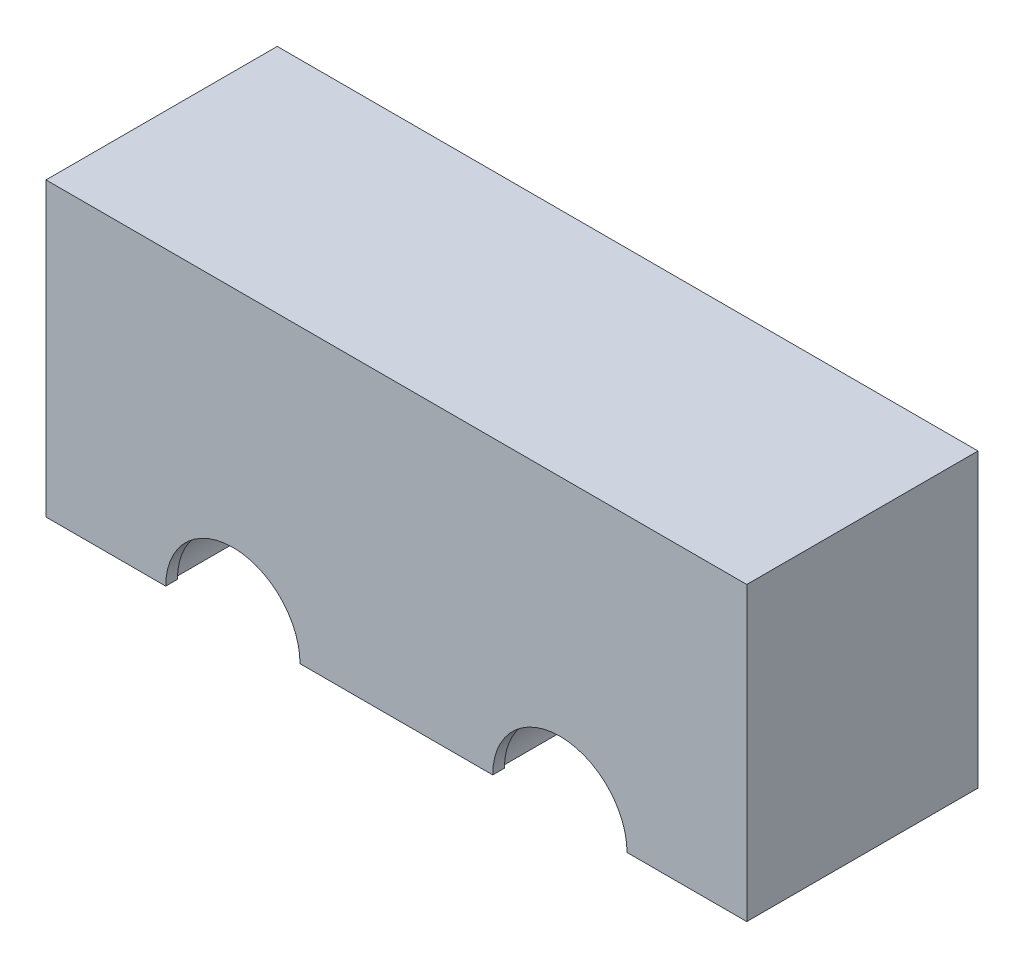
ISO-10303-21;
HEADER;
FILE_DESCRIPTION(('STEP AP214'),'2;1');
FILE_NAME('part.step','',(''),(''),'','','');
FILE_SCHEMA(('AUTOMOTIVE_DESIGN { 1 0 10303 214 1 1 1 1 }'));
ENDSEC;
DATA;
#1=APPLICATION_CONTEXT('core data for automotive mechanical design processes');
#2=APPLICATION_PROTOCOL_DEFINITION('international standard','automotive_design',2000,#1);
#3=PRODUCT_CONTEXT('',#1,'mechanical');
#4=PRODUCT('Part','Part','',(#3));
#5=PRODUCT_RELATED_PRODUCT_CATEGORY('part','',(#4));
#6=PRODUCT_DEFINITION_FORMATION('','',#4);
#7=PRODUCT_DEFINITION_CONTEXT('part definition',#1,'design');
#8=PRODUCT_DEFINITION('design','',#6,#7);
#9=PRODUCT_DEFINITION_SHAPE('','',#8);
#10=(LENGTH_UNIT() NAMED_UNIT(*) SI_UNIT(.MILLI.,.METRE.));
#11=(NAMED_UNIT(*) PLANE_ANGLE_UNIT() SI_UNIT($,.RADIAN.));
#12=(NAMED_UNIT(*) SI_UNIT($,.STERADIAN.) SOLID_ANGLE_UNIT());
#13=UNCERTAINTY_MEASURE_WITH_UNIT(LENGTH_MEASURE(1.E-05),#10,'distance_accuracy_value','');
#14=(GEOMETRIC_REPRESENTATION_CONTEXT(3) GLOBAL_UNCERTAINTY_ASSIGNED_CONTEXT((#13)) GLOBAL_UNIT_ASSIGNED_CONTEXT((#10,
#11,#12)) REPRESENTATION_CONTEXT('',''));
#15=CARTESIAN_POINT('',(0.,0.,0.));
#16=DIRECTION('',(0.,0.,1.));
#17=DIRECTION('',(1.,0.,0.));
#18=AXIS2_PLACEMENT_3D('',#15,#16,#17);
#19=CARTESIAN_POINT('',(-14.,0.,33.2164078649987));
#20=DIRECTION('',(0.,0.,-1.));
#21=DIRECTION('',(-1.,0.,0.));
#22=AXIS2_PLACEMENT_3D('',#19,#20,#21);
#23=CYLINDRICAL_SURFACE('',#22,6.);
#24=CARTESIAN_POINT('',(-14.,0.,18.8));
#25=DIRECTION('',(0.,0.,-1.));
#26=DIRECTION('',(1.,0.,0.));
#27=AXIS2_PLACEMENT_3D('',#24,#25,#26);
#28=CIRCLE('',#27,6.);
#29=CARTESIAN_POINT('',(-20.,0.,18.8));
#30=VERTEX_POINT('',#29);
#31=CARTESIAN_POINT('',(-8.,0.,18.8));
#32=VERTEX_POINT('',#31);
#33=EDGE_CURVE('E48',#30,#32,#28,.T.);
#34=ORIENTED_EDGE('',*,*,#33,.F.);
#35=DIRECTION('',(0.,0.,-1.));
#36=VECTOR('',#35,1.);
#37=CARTESIAN_POINT('',(-20.,0.,33.2164078649987));
#38=LINE('',#37,#36);
#39=CARTESIAN_POINT('',(-20.,0.,1.));
#40=VERTEX_POINT('',#39);
#41=EDGE_CURVE('E245',#30,#40,#38,.T.);
#42=ORIENTED_EDGE('',*,*,#41,.T.);
#43=CARTESIAN_POINT('',(-14.,0.,1.));
#44=DIRECTION('',(0.,0.,-1.));
#45=DIRECTION('',(1.,0.,0.));
#46=AXIS2_PLACEMENT_3D('',#43,#44,#45);
#47=CIRCLE('',#46,6.);
#48=CARTESIAN_POINT('',(-8.,0.,1.));
#49=VERTEX_POINT('',#48);
#50=EDGE_CURVE('E198',#40,#49,#47,.T.);
#51=ORIENTED_EDGE('',*,*,#50,.T.);
#52=DIRECTION('',(0.,0.,-1.));
#53=VECTOR('',#52,1.);
#54=CARTESIAN_POINT('',(-8.,0.,33.2164078649987));
#55=LINE('',#54,#53);
#56=EDGE_CURVE('E237',#32,#49,#55,.T.);
#57=ORIENTED_EDGE('',*,*,#56,.F.);
#58=EDGE_LOOP('',(#34,#42,#51,#57));
#59=FACE_BOUND('',#58,.T.);
#60=ADVANCED_FACE('F33',(#59),#23,.F.);
#61=CARTESIAN_POINT('',(14.,0.,33.2164078649987));
#62=DIRECTION('',(0.,0.,-1.));
#63=DIRECTION('',(-1.,0.,0.));
#64=AXIS2_PLACEMENT_3D('',#61,#62,#63);
#65=CYLINDRICAL_SURFACE('',#64,6.);
#66=CARTESIAN_POINT('',(14.,0.,18.8));
#67=DIRECTION('',(0.,0.,-1.));
#68=DIRECTION('',(1.,0.,0.));
#69=AXIS2_PLACEMENT_3D('',#66,#67,#68);
#70=CIRCLE('',#69,6.);
#71=CARTESIAN_POINT('',(8.,0.,18.8));
#72=VERTEX_POINT('',#71);
#73=CARTESIAN_POINT('',(20.,0.,18.8));
#74=VERTEX_POINT('',#73);
#75=EDGE_CURVE('E56',#72,#74,#70,.T.);
#76=ORIENTED_EDGE('',*,*,#75,.F.);
#77=DIRECTION('',(0.,0.,-1.));
#78=VECTOR('',#77,1.);
#79=CARTESIAN_POINT('',(8.,0.,33.2164078649987));
#80=LINE('',#79,#78);
#81=CARTESIAN_POINT('',(8.,0.,1.));
#82=VERTEX_POINT('',#81);
#83=EDGE_CURVE('E240',#72,#82,#80,.T.);
#84=ORIENTED_EDGE('',*,*,#83,.T.);
#85=CARTESIAN_POINT('',(14.,0.,1.));
#86=DIRECTION('',(0.,0.,-1.));
#87=DIRECTION('',(1.,0.,0.));
#88=AXIS2_PLACEMENT_3D('',#85,#86,#87);
#89=CIRCLE('',#88,6.);
#90=CARTESIAN_POINT('',(20.,0.,1.));
#91=VERTEX_POINT('',#90);
#92=EDGE_CURVE('E219',#82,#91,#89,.T.);
#93=ORIENTED_EDGE('',*,*,#92,.T.);
#94=DIRECTION('',(0.,0.,-1.));
#95=VECTOR('',#94,1.);
#96=CARTESIAN_POINT('',(20.,0.,33.2164078649987));
#97=LINE('',#96,#95);
#98=EDGE_CURVE('E243',#74,#91,#97,.T.);
#99=ORIENTED_EDGE('',*,*,#98,.F.);
#100=EDGE_LOOP('',(#76,#84,#93,#99));
#101=FACE_BOUND('',#100,.T.);
#102=ADVANCED_FACE('F298',(#101),#65,.F.);
#103=CARTESIAN_POINT('',(-30.,0.,19.8));
#104=DIRECTION('',(0.,1.,0.));
#105=DIRECTION('',(-1.,0.,0.));
#106=AXIS2_PLACEMENT_3D('',#103,#104,#105);
#107=PLANE('',#106);
#108=DIRECTION('',(1.,0.,0.));
#109=VECTOR('',#108,1.);
#110=CARTESIAN_POINT('',(-30.,0.,19.8));
#111=LINE('',#110,#109);
#112=CARTESIAN_POINT('',(19.75,0.,19.8));
#113=VERTEX_POINT('',#112);
#114=CARTESIAN_POINT('',(30.,0.,19.8));
#115=VERTEX_POINT('',#114);
#116=EDGE_CURVE('E158',#113,#115,#111,.T.);
#117=ORIENTED_EDGE('',*,*,#116,.F.);
#118=DIRECTION('',(0.,0.,-1.));
#119=VECTOR('',#118,1.);
#120=CARTESIAN_POINT('',(19.75,0.,19.8));
#121=LINE('',#120,#119);
#122=CARTESIAN_POINT('',(19.75,0.,18.8));
#123=VERTEX_POINT('',#122);
#124=EDGE_CURVE('E184',#113,#123,#121,.T.);
#125=ORIENTED_EDGE('',*,*,#124,.T.);
#126=DIRECTION('',(-1.,0.,0.));
#127=VECTOR('',#126,1.);
#128=CARTESIAN_POINT('',(19.75,0.,18.8));
#129=LINE('',#128,#127);
#130=EDGE_CURVE('E187',#74,#123,#129,.T.);
#131=ORIENTED_EDGE('',*,*,#130,.F.);
#132=ORIENTED_EDGE('',*,*,#98,.T.);
#133=DIRECTION('',(-1.,0.,0.));
#134=VECTOR('',#133,1.);
#135=CARTESIAN_POINT('',(19.75,0.,1.));
#136=LINE('',#135,#134);
#137=CARTESIAN_POINT('',(19.75,0.,1.));
#138=VERTEX_POINT('',#137);
#139=EDGE_CURVE('E222',#91,#138,#136,.T.);
#140=ORIENTED_EDGE('',*,*,#139,.T.);
#141=DIRECTION('',(0.,0.,-1.));
#142=VECTOR('',#141,1.);
#143=CARTESIAN_POINT('',(19.75,0.,1.));
#144=LINE('',#143,#142);
#145=CARTESIAN_POINT('',(19.75,0.,0.));
#146=VERTEX_POINT('',#145);
#147=EDGE_CURVE('E231',#138,#146,#144,.T.);
#148=ORIENTED_EDGE('',*,*,#147,.T.);
#149=DIRECTION('',(1.,0.,0.));
#150=VECTOR('',#149,1.);
#151=CARTESIAN_POINT('',(-30.,0.,0.));
#152=LINE('',#151,#150);
#153=CARTESIAN_POINT('',(30.,0.,0.));
#154=VERTEX_POINT('',#153);
#155=EDGE_CURVE('E258',#146,#154,#152,.T.);
#156=ORIENTED_EDGE('',*,*,#155,.T.);
#157=DIRECTION('',(0.,0.,-1.));
#158=VECTOR('',#157,1.);
#159=CARTESIAN_POINT('',(30.,0.,19.8));
#160=LINE('',#159,#158);
#161=EDGE_CURVE('E41',#115,#154,#160,.T.);
#162=ORIENTED_EDGE('',*,*,#161,.F.);
#163=EDGE_LOOP('',(#117,#125,#131,#132,#140,#148,#156,#162));
#164=FACE_BOUND('',#163,.T.);
#165=ADVANCED_FACE('F289',(#164),#107,.F.);
#166=CARTESIAN_POINT('',(-8.25,0.,0.));
#167=VERTEX_POINT('',#166);
#168=CARTESIAN_POINT('',(8.24999999999999,0.,0.));
#169=VERTEX_POINT('',#168);
#170=EDGE_CURVE('E262',#167,#169,#152,.T.);
#171=ORIENTED_EDGE('',*,*,#170,.T.);
#172=DIRECTION('',(0.,0.,-1.));
#173=VECTOR('',#172,1.);
#174=CARTESIAN_POINT('',(8.24999999999999,0.,1.));
#175=LINE('',#174,#173);
#176=CARTESIAN_POINT('',(8.24999999999999,0.,1.));
#177=VERTEX_POINT('',#176);
#178=EDGE_CURVE('E234',#177,#169,#175,.T.);
#179=ORIENTED_EDGE('',*,*,#178,.F.);
#180=DIRECTION('',(-1.,0.,0.));
#181=VECTOR('',#180,1.);
#182=CARTESIAN_POINT('',(8.24999999999999,0.,1.));
#183=LINE('',#182,#181);
#184=EDGE_CURVE('E228',#177,#82,#183,.T.);
#185=ORIENTED_EDGE('',*,*,#184,.T.);
#186=ORIENTED_EDGE('',*,*,#83,.F.);
#187=DIRECTION('',(-1.,0.,0.));
#188=VECTOR('',#187,1.);
#189=CARTESIAN_POINT('',(8.24999999999999,0.,18.8));
#190=LINE('',#189,#188);
#191=CARTESIAN_POINT('',(8.24999999999999,0.,18.8));
#192=VERTEX_POINT('',#191);
#193=EDGE_CURVE('E185',#192,#72,#190,.T.);
#194=ORIENTED_EDGE('',*,*,#193,.F.);
#195=DIRECTION('',(0.,0.,-1.));
#196=VECTOR('',#195,1.);
#197=CARTESIAN_POINT('',(8.24999999999999,0.,19.8));
#198=LINE('',#197,#196);
#199=CARTESIAN_POINT('',(8.24999999999999,0.,19.8));
#200=VERTEX_POINT('',#199);
#201=EDGE_CURVE('E152',#200,#192,#198,.T.);
#202=ORIENTED_EDGE('',*,*,#201,.F.);
#203=CARTESIAN_POINT('',(-8.25,0.,19.8));
#204=VERTEX_POINT('',#203);
#205=EDGE_CURVE('E145',#204,#200,#111,.T.);
#206=ORIENTED_EDGE('',*,*,#205,.F.);
#207=DIRECTION('',(0.,0.,-1.));
#208=VECTOR('',#207,1.);
#209=CARTESIAN_POINT('',(-8.25,0.,19.8));
#210=LINE('',#209,#208);
#211=CARTESIAN_POINT('',(-8.25,0.,18.8));
#212=VERTEX_POINT('',#211);
#213=EDGE_CURVE('E149',#204,#212,#210,.T.);
#214=ORIENTED_EDGE('',*,*,#213,.T.);
#215=DIRECTION('',(-1.,1.85289101474809E-13,0.));
#216=VECTOR('',#215,1.);
#217=CARTESIAN_POINT('',(-8.,0.,18.8));
#218=LINE('',#217,#216);
#219=EDGE_CURVE('E178',#32,#212,#218,.T.);
#220=ORIENTED_EDGE('',*,*,#219,.F.);
#221=ORIENTED_EDGE('',*,*,#56,.T.);
#222=DIRECTION('',(-1.,1.85289101474809E-13,0.));
#223=VECTOR('',#222,1.);
#224=CARTESIAN_POINT('',(-8.,0.,1.));
#225=LINE('',#224,#223);
#226=CARTESIAN_POINT('',(-8.25,0.,1.));
#227=VERTEX_POINT('',#226);
#228=EDGE_CURVE('E201',#49,#227,#225,.T.);
#229=ORIENTED_EDGE('',*,*,#228,.T.);
#230=DIRECTION('',(0.,0.,-1.));
#231=VECTOR('',#230,1.);
#232=CARTESIAN_POINT('',(-8.25,0.,1.));
#233=LINE('',#232,#231);
#234=EDGE_CURVE('E210',#227,#167,#233,.T.);
#235=ORIENTED_EDGE('',*,*,#234,.T.);
#236=EDGE_LOOP('',(#171,#179,#185,#186,#194,#202,#206,#214,#220,#221,#229,#235));
#237=FACE_BOUND('',#236,.T.);
#238=ADVANCED_FACE('F147',(#237),#107,.F.);
#239=CARTESIAN_POINT('',(-30.,0.,19.8));
#240=DIRECTION('',(1.,0.,0.));
#241=DIRECTION('',(0.,0.,-1.));
#242=AXIS2_PLACEMENT_3D('',#239,#240,#241);
#243=PLANE('',#242);
#244=DIRECTION('',(0.,-1.,0.));
#245=VECTOR('',#244,1.);
#246=CARTESIAN_POINT('',(-30.,0.,0.));
#247=LINE('',#246,#245);
#248=CARTESIAN_POINT('',(-30.,25.,0.));
#249=VERTEX_POINT('',#248);
#250=CARTESIAN_POINT('',(-30.,0.,0.));
#251=VERTEX_POINT('',#250);
#252=EDGE_CURVE('E242',#249,#251,#247,.T.);
#253=ORIENTED_EDGE('',*,*,#252,.T.);
#254=DIRECTION('',(0.,0.,-1.));
#255=VECTOR('',#254,1.);
#256=CARTESIAN_POINT('',(-30.,0.,19.8));
#257=LINE('',#256,#255);
#258=CARTESIAN_POINT('',(-30.,0.,19.8));
#259=VERTEX_POINT('',#258);
#260=EDGE_CURVE('E11',#259,#251,#257,.T.);
#261=ORIENTED_EDGE('',*,*,#260,.F.);
#262=DIRECTION('',(0.,-1.,0.));
#263=VECTOR('',#262,1.);
#264=CARTESIAN_POINT('',(-30.,0.,19.8));
#265=LINE('',#264,#263);
#266=CARTESIAN_POINT('',(-30.,25.,19.8));
#267=VERTEX_POINT('',#266);
#268=EDGE_CURVE('E248',#267,#259,#265,.T.);
#269=ORIENTED_EDGE('',*,*,#268,.F.);
#270=DIRECTION('',(0.,0.,-1.));
#271=VECTOR('',#270,1.);
#272=CARTESIAN_POINT('',(-30.,25.,19.8));
#273=LINE('',#272,#271);
#274=EDGE_CURVE('E255',#267,#249,#273,.T.);
#275=ORIENTED_EDGE('',*,*,#274,.T.);
#276=EDGE_LOOP('',(#253,#261,#269,#275));
#277=FACE_BOUND('',#276,.T.);
#278=ADVANCED_FACE('F35',(#277),#243,.F.);
#279=CARTESIAN_POINT('',(-19.75,0.,0.));
#280=VERTEX_POINT('',#279);
#281=EDGE_CURVE('E259',#251,#280,#152,.T.);
#282=ORIENTED_EDGE('',*,*,#281,.T.);
#283=DIRECTION('',(0.,0.,-1.));
#284=VECTOR('',#283,1.);
#285=CARTESIAN_POINT('',(-19.75,0.,1.));
#286=LINE('',#285,#284);
#287=CARTESIAN_POINT('',(-19.75,0.,1.));
#288=VERTEX_POINT('',#287);
#289=EDGE_CURVE('E213',#288,#280,#286,.T.);
#290=ORIENTED_EDGE('',*,*,#289,.F.);
#291=DIRECTION('',(-1.,0.,0.));
#292=VECTOR('',#291,1.);
#293=CARTESIAN_POINT('',(-20.,0.,1.));
#294=LINE('',#293,#292);
#295=EDGE_CURVE('E207',#288,#40,#294,.T.);
#296=ORIENTED_EDGE('',*,*,#295,.T.);
#297=ORIENTED_EDGE('',*,*,#41,.F.);
#298=DIRECTION('',(-1.,0.,0.));
#299=VECTOR('',#298,1.);
#300=CARTESIAN_POINT('',(-20.,0.,18.8));
#301=LINE('',#300,#299);
#302=CARTESIAN_POINT('',(-19.75,0.,18.8));
#303=VERTEX_POINT('',#302);
#304=EDGE_CURVE('E172',#303,#30,#301,.T.);
#305=ORIENTED_EDGE('',*,*,#304,.F.);
#306=DIRECTION('',(0.,0.,-1.));
#307=VECTOR('',#306,1.);
#308=CARTESIAN_POINT('',(-19.75,0.,19.8));
#309=LINE('',#308,#307);
#310=CARTESIAN_POINT('',(-19.75,0.,19.8));
#311=VERTEX_POINT('',#310);
#312=EDGE_CURVE('E167',#311,#303,#309,.T.);
#313=ORIENTED_EDGE('',*,*,#312,.F.);
#314=EDGE_CURVE('E157',#259,#311,#111,.T.);
#315=ORIENTED_EDGE('',*,*,#314,.F.);
#316=ORIENTED_EDGE('',*,*,#260,.T.);
#317=EDGE_LOOP('',(#282,#290,#296,#297,#305,#313,#315,#316));
#318=FACE_BOUND('',#317,.T.);
#319=ADVANCED_FACE('F312',(#318),#107,.F.);
#320=CARTESIAN_POINT('',(30.,0.,19.8));
#321=DIRECTION('',(-1.,0.,0.));
#322=DIRECTION('',(0.,0.,1.));
#323=AXIS2_PLACEMENT_3D('',#320,#321,#322);
#324=PLANE('',#323);
#325=DIRECTION('',(0.,1.,0.));
#326=VECTOR('',#325,1.);
#327=CARTESIAN_POINT('',(30.,0.,0.));
#328=LINE('',#327,#326);
#329=CARTESIAN_POINT('',(30.,25.,0.));
#330=VERTEX_POINT('',#329);
#331=EDGE_CURVE('E261',#154,#330,#328,.T.);
#332=ORIENTED_EDGE('',*,*,#331,.T.);
#333=DIRECTION('',(0.,0.,-1.));
#334=VECTOR('',#333,1.);
#335=CARTESIAN_POINT('',(30.,25.,19.8));
#336=LINE('',#335,#334);
#337=CARTESIAN_POINT('',(30.,25.,19.8));
#338=VERTEX_POINT('',#337);
#339=EDGE_CURVE('E267',#338,#330,#336,.T.);
#340=ORIENTED_EDGE('',*,*,#339,.F.);
#341=DIRECTION('',(0.,1.,0.));
#342=VECTOR('',#341,1.);
#343=CARTESIAN_POINT('',(30.,0.,19.8));
#344=LINE('',#343,#342);
#345=EDGE_CURVE('E251',#115,#338,#344,.T.);
#346=ORIENTED_EDGE('',*,*,#345,.F.);
#347=ORIENTED_EDGE('',*,*,#161,.T.);
#348=EDGE_LOOP('',(#332,#340,#346,#347));
#349=FACE_BOUND('',#348,.T.);
#350=ADVANCED_FACE('F274',(#349),#324,.F.);
#351=CARTESIAN_POINT('',(-30.,25.,19.8));
#352=DIRECTION('',(0.,-1.,0.));
#353=DIRECTION('',(1.,0.,0.));
#354=AXIS2_PLACEMENT_3D('',#351,#352,#353);
#355=PLANE('',#354);
#356=DIRECTION('',(-1.,0.,0.));
#357=VECTOR('',#356,1.);
#358=CARTESIAN_POINT('',(-30.,25.,0.));
#359=LINE('',#358,#357);
#360=EDGE_CURVE('E249',#330,#249,#359,.T.);
#361=ORIENTED_EDGE('',*,*,#360,.T.);
#362=ORIENTED_EDGE('',*,*,#274,.F.);
#363=DIRECTION('',(-1.,0.,0.));
#364=VECTOR('',#363,1.);
#365=CARTESIAN_POINT('',(-30.,25.,19.8));
#366=LINE('',#365,#364);
#367=EDGE_CURVE('E253',#338,#267,#366,.T.);
#368=ORIENTED_EDGE('',*,*,#367,.F.);
#369=ORIENTED_EDGE('',*,*,#339,.T.);
#370=EDGE_LOOP('',(#361,#362,#368,#369));
#371=FACE_BOUND('',#370,.T.);
#372=ADVANCED_FACE('F283',(#371),#355,.F.);
#373=CARTESIAN_POINT('',(0.,0.,19.8));
#374=DIRECTION('',(0.,0.,-1.));
#375=DIRECTION('',(-1.,0.,0.));
#376=AXIS2_PLACEMENT_3D('',#373,#374,#375);
#377=PLANE('',#376);
#378=ORIENTED_EDGE('',*,*,#205,.T.);
#379=CARTESIAN_POINT('',(14.,0.,19.8));
#380=DIRECTION('',(0.,0.,1.));
#381=DIRECTION('',(1.,0.,0.));
#382=AXIS2_PLACEMENT_3D('',#379,#380,#381);
#383=CIRCLE('',#382,5.75);
#384=EDGE_CURVE('E182',#113,#200,#383,.T.);
#385=ORIENTED_EDGE('',*,*,#384,.F.);
#386=ORIENTED_EDGE('',*,*,#116,.T.);
#387=ORIENTED_EDGE('',*,*,#345,.T.);
#388=ORIENTED_EDGE('',*,*,#367,.T.);
#389=ORIENTED_EDGE('',*,*,#268,.T.);
#390=ORIENTED_EDGE('',*,*,#314,.T.);
#391=CARTESIAN_POINT('',(-14.,0.,19.8));
#392=DIRECTION('',(0.,0.,1.));
#393=DIRECTION('',(1.,0.,0.));
#394=AXIS2_PLACEMENT_3D('',#391,#392,#393);
#395=CIRCLE('',#394,5.75);
#396=EDGE_CURVE('E163',#204,#311,#395,.T.);
#397=ORIENTED_EDGE('',*,*,#396,.F.);
#398=EDGE_LOOP('',(#378,#385,#386,#387,#388,#389,#390,#397));
#399=FACE_BOUND('',#398,.T.);
#400=ADVANCED_FACE('F169',(#399),#377,.F.);
#401=CARTESIAN_POINT('',(0.,0.,0.));
#402=DIRECTION('',(0.,0.,-1.));
#403=DIRECTION('',(-1.,0.,0.));
#404=AXIS2_PLACEMENT_3D('',#401,#402,#403);
#405=PLANE('',#404);
#406=ORIENTED_EDGE('',*,*,#155,.F.);
#407=CARTESIAN_POINT('',(14.,0.,0.));
#408=DIRECTION('',(0.,0.,1.));
#409=DIRECTION('',(1.,0.,0.));
#410=AXIS2_PLACEMENT_3D('',#407,#408,#409);
#411=CIRCLE('',#410,5.75);
#412=EDGE_CURVE('E216',#146,#169,#411,.T.);
#413=ORIENTED_EDGE('',*,*,#412,.T.);
#414=ORIENTED_EDGE('',*,*,#170,.F.);
#415=CARTESIAN_POINT('',(-14.,0.,0.));
#416=DIRECTION('',(0.,0.,1.));
#417=DIRECTION('',(1.,0.,0.));
#418=AXIS2_PLACEMENT_3D('',#415,#416,#417);
#419=CIRCLE('',#418,5.75);
#420=EDGE_CURVE('E196',#167,#280,#419,.T.);
#421=ORIENTED_EDGE('',*,*,#420,.T.);
#422=ORIENTED_EDGE('',*,*,#281,.F.);
#423=ORIENTED_EDGE('',*,*,#252,.F.);
#424=ORIENTED_EDGE('',*,*,#360,.F.);
#425=ORIENTED_EDGE('',*,*,#331,.F.);
#426=EDGE_LOOP('',(#406,#413,#414,#421,#422,#423,#424,#425));
#427=FACE_BOUND('',#426,.T.);
#428=ADVANCED_FACE('F279',(#427),#405,.T.);
#429=CARTESIAN_POINT('',(14.,0.,1.));
#430=DIRECTION('',(0.,0.,-1.));
#431=DIRECTION('',(-1.,0.,0.));
#432=AXIS2_PLACEMENT_3D('',#429,#430,#431);
#433=CYLINDRICAL_SURFACE('',#432,5.75);
#434=ORIENTED_EDGE('',*,*,#412,.F.);
#435=ORIENTED_EDGE('',*,*,#147,.F.);
#436=CARTESIAN_POINT('',(14.,0.,1.));
#437=DIRECTION('',(0.,0.,1.));
#438=DIRECTION('',(1.,0.,0.));
#439=AXIS2_PLACEMENT_3D('',#436,#437,#438);
#440=CIRCLE('',#439,5.75);
#441=EDGE_CURVE('E225',#138,#177,#440,.T.);
#442=ORIENTED_EDGE('',*,*,#441,.T.);
#443=ORIENTED_EDGE('',*,*,#178,.T.);
#444=EDGE_LOOP('',(#434,#435,#442,#443));
#445=FACE_BOUND('',#444,.T.);
#446=ADVANCED_FACE('F305',(#445),#433,.F.);
#447=CARTESIAN_POINT('',(14.,0.,1.));
#448=DIRECTION('',(0.,0.,1.));
#449=DIRECTION('',(1.,0.,0.));
#450=AXIS2_PLACEMENT_3D('',#447,#448,#449);
#451=PLANE('',#450);
#452=ORIENTED_EDGE('',*,*,#92,.F.);
#453=ORIENTED_EDGE('',*,*,#184,.F.);
#454=ORIENTED_EDGE('',*,*,#441,.F.);
#455=ORIENTED_EDGE('',*,*,#139,.F.);
#456=EDGE_LOOP('',(#452,#453,#454,#455));
#457=FACE_BOUND('',#456,.T.);
#458=ADVANCED_FACE('F302',(#457),#451,.T.);
#459=CARTESIAN_POINT('',(-14.,0.,1.));
#460=DIRECTION('',(0.,0.,-1.));
#461=DIRECTION('',(-1.,0.,0.));
#462=AXIS2_PLACEMENT_3D('',#459,#460,#461);
#463=CYLINDRICAL_SURFACE('',#462,5.75);
#464=ORIENTED_EDGE('',*,*,#420,.F.);
#465=ORIENTED_EDGE('',*,*,#234,.F.);
#466=CARTESIAN_POINT('',(-14.,0.,1.));
#467=DIRECTION('',(0.,0.,1.));
#468=DIRECTION('',(1.,0.,0.));
#469=AXIS2_PLACEMENT_3D('',#466,#467,#468);
#470=CIRCLE('',#469,5.75);
#471=EDGE_CURVE('E204',#227,#288,#470,.T.);
#472=ORIENTED_EDGE('',*,*,#471,.T.);
#473=ORIENTED_EDGE('',*,*,#289,.T.);
#474=EDGE_LOOP('',(#464,#465,#472,#473));
#475=FACE_BOUND('',#474,.T.);
#476=ADVANCED_FACE('F308',(#475),#463,.F.);
#477=CARTESIAN_POINT('',(-14.,0.,1.));
#478=DIRECTION('',(0.,0.,1.));
#479=DIRECTION('',(1.,0.,0.));
#480=AXIS2_PLACEMENT_3D('',#477,#478,#479);
#481=PLANE('',#480);
#482=ORIENTED_EDGE('',*,*,#50,.F.);
#483=ORIENTED_EDGE('',*,*,#295,.F.);
#484=ORIENTED_EDGE('',*,*,#471,.F.);
#485=ORIENTED_EDGE('',*,*,#228,.F.);
#486=EDGE_LOOP('',(#482,#483,#484,#485));
#487=FACE_BOUND('',#486,.T.);
#488=ADVANCED_FACE('F319',(#487),#481,.T.);
#489=CARTESIAN_POINT('',(14.,0.,19.8));
#490=DIRECTION('',(0.,0.,-1.));
#491=DIRECTION('',(-1.,0.,0.));
#492=AXIS2_PLACEMENT_3D('',#489,#490,#491);
#493=CYLINDRICAL_SURFACE('',#492,5.75);
#494=CARTESIAN_POINT('',(14.,0.,18.8));
#495=DIRECTION('',(0.,0.,1.));
#496=DIRECTION('',(1.,0.,0.));
#497=AXIS2_PLACEMENT_3D('',#494,#495,#496);
#498=CIRCLE('',#497,5.75);
#499=EDGE_CURVE('E190',#123,#192,#498,.T.);
#500=ORIENTED_EDGE('',*,*,#499,.F.);
#501=ORIENTED_EDGE('',*,*,#124,.F.);
#502=ORIENTED_EDGE('',*,*,#384,.T.);
#503=ORIENTED_EDGE('',*,*,#201,.T.);
#504=EDGE_LOOP('',(#500,#501,#502,#503));
#505=FACE_BOUND('',#504,.T.);
#506=ADVANCED_FACE('F293',(#505),#493,.F.);
#507=CARTESIAN_POINT('',(14.,0.,18.8));
#508=DIRECTION('',(0.,0.,1.));
#509=DIRECTION('',(1.,0.,0.));
#510=AXIS2_PLACEMENT_3D('',#507,#508,#509);
#511=PLANE('',#510);
#512=ORIENTED_EDGE('',*,*,#75,.T.);
#513=ORIENTED_EDGE('',*,*,#130,.T.);
#514=ORIENTED_EDGE('',*,*,#499,.T.);
#515=ORIENTED_EDGE('',*,*,#193,.T.);
#516=EDGE_LOOP('',(#512,#513,#514,#515));
#517=FACE_BOUND('',#516,.T.);
#518=ADVANCED_FACE('F295',(#517),#511,.F.);
#519=CARTESIAN_POINT('',(-14.,0.,19.8));
#520=DIRECTION('',(0.,0.,-1.));
#521=DIRECTION('',(-1.,0.,0.));
#522=AXIS2_PLACEMENT_3D('',#519,#520,#521);
#523=CYLINDRICAL_SURFACE('',#522,5.75);
#524=CARTESIAN_POINT('',(-14.,0.,18.8));
#525=DIRECTION('',(0.,0.,1.));
#526=DIRECTION('',(1.,0.,0.));
#527=AXIS2_PLACEMENT_3D('',#524,#525,#526);
#528=CIRCLE('',#527,5.75);
#529=EDGE_CURVE('E165',#212,#303,#528,.T.);
#530=ORIENTED_EDGE('',*,*,#529,.F.);
#531=ORIENTED_EDGE('',*,*,#213,.F.);
#532=ORIENTED_EDGE('',*,*,#396,.T.);
#533=ORIENTED_EDGE('',*,*,#312,.T.);
#534=EDGE_LOOP('',(#530,#531,#532,#533));
#535=FACE_BOUND('',#534,.T.);
#536=ADVANCED_FACE('F162',(#535),#523,.F.);
#537=CARTESIAN_POINT('',(-14.,0.,18.8));
#538=DIRECTION('',(0.,0.,1.));
#539=DIRECTION('',(1.,0.,0.));
#540=AXIS2_PLACEMENT_3D('',#537,#538,#539);
#541=PLANE('',#540);
#542=ORIENTED_EDGE('',*,*,#33,.T.);
#543=ORIENTED_EDGE('',*,*,#219,.T.);
#544=ORIENTED_EDGE('',*,*,#529,.T.);
#545=ORIENTED_EDGE('',*,*,#304,.T.);
#546=EDGE_LOOP('',(#542,#543,#544,#545));
#547=FACE_BOUND('',#546,.T.);
#548=ADVANCED_FACE('F315',(#547),#541,.F.);
#549=CLOSED_SHELL('',(#60,#102,#165,#238,#278,#319,#350,#372,#400,#428,#446,#458,#476,#488,#506,
#518,#536,#548));
#550=MANIFOLD_SOLID_BREP('B2',#549);
#551=ADVANCED_BREP_SHAPE_REPRESENTATION('',(#18,#550),#14);
#552=SHAPE_DEFINITION_REPRESENTATION(#9,#551);
ENDSEC;
END-ISO-10303-21;
